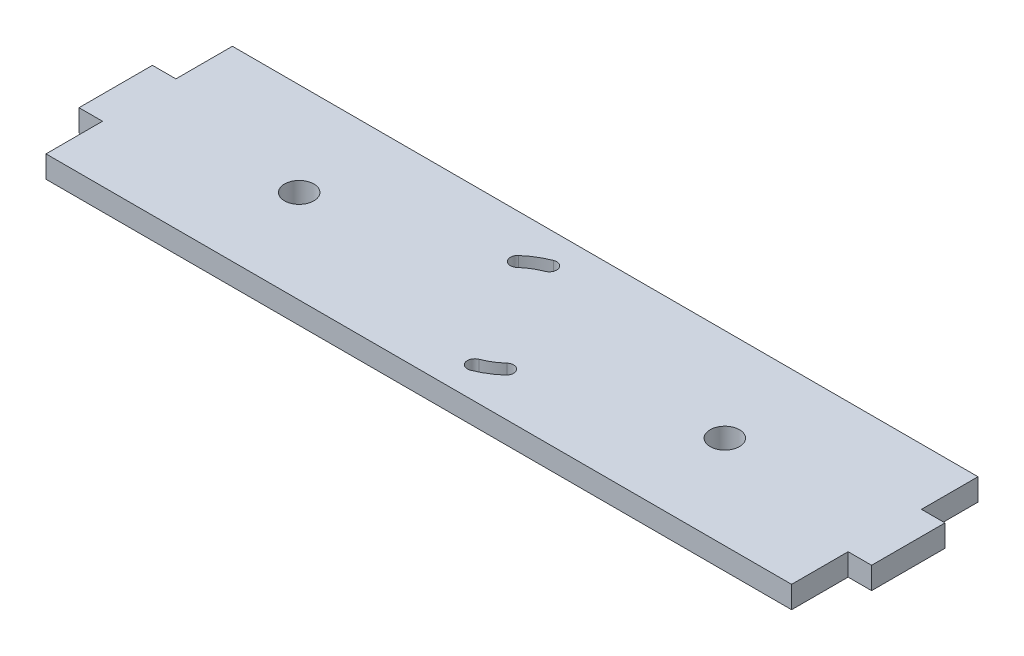
ISO-10303-21;
HEADER;
FILE_DESCRIPTION(('STEP AP214'),'2;1');
FILE_NAME('part.step','',(''),(''),'','','');
FILE_SCHEMA(('AUTOMOTIVE_DESIGN { 1 0 10303 214 1 1 1 1 }'));
ENDSEC;
DATA;
#1=APPLICATION_CONTEXT('core data for automotive mechanical design processes');
#2=APPLICATION_PROTOCOL_DEFINITION('international standard','automotive_design',2000,#1);
#3=PRODUCT_CONTEXT('',#1,'mechanical');
#4=PRODUCT('Part','Part','',(#3));
#5=PRODUCT_RELATED_PRODUCT_CATEGORY('part','',(#4));
#6=PRODUCT_DEFINITION_FORMATION('','',#4);
#7=PRODUCT_DEFINITION_CONTEXT('part definition',#1,'design');
#8=PRODUCT_DEFINITION('design','',#6,#7);
#9=PRODUCT_DEFINITION_SHAPE('','',#8);
#10=(LENGTH_UNIT() NAMED_UNIT(*) SI_UNIT(.MILLI.,.METRE.));
#11=(NAMED_UNIT(*) PLANE_ANGLE_UNIT() SI_UNIT($,.RADIAN.));
#12=(NAMED_UNIT(*) SI_UNIT($,.STERADIAN.) SOLID_ANGLE_UNIT());
#13=UNCERTAINTY_MEASURE_WITH_UNIT(LENGTH_MEASURE(1.E-05),#10,'distance_accuracy_value','');
#14=(GEOMETRIC_REPRESENTATION_CONTEXT(3) GLOBAL_UNCERTAINTY_ASSIGNED_CONTEXT((#13)) GLOBAL_UNIT_ASSIGNED_CONTEXT((#10,
#11,#12)) REPRESENTATION_CONTEXT('',''));
#15=CARTESIAN_POINT('',(0.,0.,0.));
#16=DIRECTION('',(0.,0.,1.));
#17=DIRECTION('',(1.,0.,0.));
#18=AXIS2_PLACEMENT_3D('',#15,#16,#17);
#19=CARTESIAN_POINT('',(-54.,3.,-5.));
#20=DIRECTION('',(0.,0.,1.));
#21=DIRECTION('',(1.,0.,0.));
#22=AXIS2_PLACEMENT_3D('',#19,#20,#21);
#23=PLANE('',#22);
#24=DIRECTION('',(-1.,0.,0.));
#25=VECTOR('',#24,1.);
#26=CARTESIAN_POINT('',(-54.,0.,-5.));
#27=LINE('',#26,#25);
#28=CARTESIAN_POINT('',(-50.8,0.,-5.));
#29=VERTEX_POINT('',#28);
#30=CARTESIAN_POINT('',(-54.,0.,-5.));
#31=VERTEX_POINT('',#30);
#32=EDGE_CURVE('E234',#29,#31,#27,.T.);
#33=ORIENTED_EDGE('',*,*,#32,.T.);
#34=DIRECTION('',(0.,-1.,0.));
#35=VECTOR('',#34,1.);
#36=CARTESIAN_POINT('',(-54.,3.,-5.));
#37=LINE('',#36,#35);
#38=CARTESIAN_POINT('',(-54.,3.,-5.));
#39=VERTEX_POINT('',#38);
#40=EDGE_CURVE('E11',#39,#31,#37,.T.);
#41=ORIENTED_EDGE('',*,*,#40,.F.);
#42=DIRECTION('',(-1.,0.,0.));
#43=VECTOR('',#42,1.);
#44=CARTESIAN_POINT('',(-54.,3.,-5.));
#45=LINE('',#44,#43);
#46=CARTESIAN_POINT('',(-50.8,3.,-5.));
#47=VERTEX_POINT('',#46);
#48=EDGE_CURVE('E241',#47,#39,#45,.T.);
#49=ORIENTED_EDGE('',*,*,#48,.F.);
#50=DIRECTION('',(0.,-1.,0.));
#51=VECTOR('',#50,1.);
#52=CARTESIAN_POINT('',(-50.8,3.,-5.));
#53=LINE('',#52,#51);
#54=EDGE_CURVE('E267',#47,#29,#53,.T.);
#55=ORIENTED_EDGE('',*,*,#54,.T.);
#56=EDGE_LOOP('',(#33,#41,#49,#55));
#57=FACE_BOUND('',#56,.T.);
#58=ADVANCED_FACE('F32',(#57),#23,.F.);
#59=CARTESIAN_POINT('',(-54.,3.,-5.));
#60=DIRECTION('',(1.,0.,0.));
#61=DIRECTION('',(0.,0.,-1.));
#62=AXIS2_PLACEMENT_3D('',#59,#60,#61);
#63=PLANE('',#62);
#64=DIRECTION('',(0.,0.,1.));
#65=VECTOR('',#64,1.);
#66=CARTESIAN_POINT('',(-54.,0.,-5.));
#67=LINE('',#66,#65);
#68=CARTESIAN_POINT('',(-54.,0.,5.));
#69=VERTEX_POINT('',#68);
#70=EDGE_CURVE('E270',#31,#69,#67,.T.);
#71=ORIENTED_EDGE('',*,*,#70,.T.);
#72=DIRECTION('',(0.,-1.,0.));
#73=VECTOR('',#72,1.);
#74=CARTESIAN_POINT('',(-54.,3.,5.));
#75=LINE('',#74,#73);
#76=CARTESIAN_POINT('',(-54.,3.,5.));
#77=VERTEX_POINT('',#76);
#78=EDGE_CURVE('E39',#77,#69,#75,.T.);
#79=ORIENTED_EDGE('',*,*,#78,.F.);
#80=DIRECTION('',(0.,0.,1.));
#81=VECTOR('',#80,1.);
#82=CARTESIAN_POINT('',(-54.,3.,-5.));
#83=LINE('',#82,#81);
#84=EDGE_CURVE('E244',#39,#77,#83,.T.);
#85=ORIENTED_EDGE('',*,*,#84,.F.);
#86=ORIENTED_EDGE('',*,*,#40,.T.);
#87=EDGE_LOOP('',(#71,#79,#85,#86));
#88=FACE_BOUND('',#87,.T.);
#89=ADVANCED_FACE('F346',(#88),#63,.F.);
#90=CARTESIAN_POINT('',(-54.,3.,5.));
#91=DIRECTION('',(0.,0.,-1.));
#92=DIRECTION('',(-1.,0.,0.));
#93=AXIS2_PLACEMENT_3D('',#90,#91,#92);
#94=PLANE('',#93);
#95=DIRECTION('',(1.,0.,0.));
#96=VECTOR('',#95,1.);
#97=CARTESIAN_POINT('',(-54.,0.,5.));
#98=LINE('',#97,#96);
#99=CARTESIAN_POINT('',(-50.8,0.,4.99999999999999));
#100=VERTEX_POINT('',#99);
#101=EDGE_CURVE('E272',#69,#100,#98,.T.);
#102=ORIENTED_EDGE('',*,*,#101,.T.);
#103=DIRECTION('',(0.,-1.,0.));
#104=VECTOR('',#103,1.);
#105=CARTESIAN_POINT('',(-50.8,3.,4.99999999999999));
#106=LINE('',#105,#104);
#107=CARTESIAN_POINT('',(-50.8,3.,4.99999999999999));
#108=VERTEX_POINT('',#107);
#109=EDGE_CURVE('E317',#108,#100,#106,.T.);
#110=ORIENTED_EDGE('',*,*,#109,.F.);
#111=DIRECTION('',(1.,0.,0.));
#112=VECTOR('',#111,1.);
#113=CARTESIAN_POINT('',(-54.,3.,5.));
#114=LINE('',#113,#112);
#115=EDGE_CURVE('E247',#77,#108,#114,.T.);
#116=ORIENTED_EDGE('',*,*,#115,.F.);
#117=ORIENTED_EDGE('',*,*,#78,.T.);
#118=EDGE_LOOP('',(#102,#110,#116,#117));
#119=FACE_BOUND('',#118,.T.);
#120=ADVANCED_FACE('F324',(#119),#94,.F.);
#121=CARTESIAN_POINT('',(-50.8,3.,4.99999999999999));
#122=DIRECTION('',(1.,0.,0.));
#123=DIRECTION('',(0.,0.,-1.));
#124=AXIS2_PLACEMENT_3D('',#121,#122,#123);
#125=PLANE('',#124);
#126=DIRECTION('',(0.,0.,1.));
#127=VECTOR('',#126,1.);
#128=CARTESIAN_POINT('',(-50.8,0.,4.99999999999999));
#129=LINE('',#128,#127);
#130=CARTESIAN_POINT('',(-50.8,0.,12.7));
#131=VERTEX_POINT('',#130);
#132=EDGE_CURVE('E274',#100,#131,#129,.T.);
#133=ORIENTED_EDGE('',*,*,#132,.T.);
#134=DIRECTION('',(0.,-1.,0.));
#135=VECTOR('',#134,1.);
#136=CARTESIAN_POINT('',(-50.8,3.,12.7));
#137=LINE('',#136,#135);
#138=CARTESIAN_POINT('',(-50.8,3.,12.7));
#139=VERTEX_POINT('',#138);
#140=EDGE_CURVE('E314',#139,#131,#137,.T.);
#141=ORIENTED_EDGE('',*,*,#140,.F.);
#142=DIRECTION('',(0.,0.,1.));
#143=VECTOR('',#142,1.);
#144=CARTESIAN_POINT('',(-50.8,3.,4.99999999999999));
#145=LINE('',#144,#143);
#146=EDGE_CURVE('E249',#108,#139,#145,.T.);
#147=ORIENTED_EDGE('',*,*,#146,.F.);
#148=ORIENTED_EDGE('',*,*,#109,.T.);
#149=EDGE_LOOP('',(#133,#141,#147,#148));
#150=FACE_BOUND('',#149,.T.);
#151=ADVANCED_FACE('F334',(#150),#125,.F.);
#152=CARTESIAN_POINT('',(-50.8,3.,12.7));
#153=DIRECTION('',(0.,0.,-1.));
#154=DIRECTION('',(-1.,0.,0.));
#155=AXIS2_PLACEMENT_3D('',#152,#153,#154);
#156=PLANE('',#155);
#157=DIRECTION('',(1.,0.,0.));
#158=VECTOR('',#157,1.);
#159=CARTESIAN_POINT('',(-50.8,0.,12.7));
#160=LINE('',#159,#158);
#161=CARTESIAN_POINT('',(50.8,0.,12.7));
#162=VERTEX_POINT('',#161);
#163=EDGE_CURVE('E276',#131,#162,#160,.T.);
#164=ORIENTED_EDGE('',*,*,#163,.T.);
#165=DIRECTION('',(0.,-1.,0.));
#166=VECTOR('',#165,1.);
#167=CARTESIAN_POINT('',(50.8,3.,12.7));
#168=LINE('',#167,#166);
#169=CARTESIAN_POINT('',(50.8,3.,12.7));
#170=VERTEX_POINT('',#169);
#171=EDGE_CURVE('E311',#170,#162,#168,.T.);
#172=ORIENTED_EDGE('',*,*,#171,.F.);
#173=DIRECTION('',(1.,0.,0.));
#174=VECTOR('',#173,1.);
#175=CARTESIAN_POINT('',(-50.8,3.,12.7));
#176=LINE('',#175,#174);
#177=EDGE_CURVE('E251',#139,#170,#176,.T.);
#178=ORIENTED_EDGE('',*,*,#177,.F.);
#179=ORIENTED_EDGE('',*,*,#140,.T.);
#180=EDGE_LOOP('',(#164,#172,#178,#179));
#181=FACE_BOUND('',#180,.T.);
#182=ADVANCED_FACE('F338',(#181),#156,.F.);
#183=CARTESIAN_POINT('',(50.8,3.,4.99999999999999));
#184=DIRECTION('',(-1.,0.,0.));
#185=DIRECTION('',(0.,0.,1.));
#186=AXIS2_PLACEMENT_3D('',#183,#184,#185);
#187=PLANE('',#186);
#188=DIRECTION('',(0.,0.,-1.));
#189=VECTOR('',#188,1.);
#190=CARTESIAN_POINT('',(50.8,0.,4.99999999999999));
#191=LINE('',#190,#189);
#192=CARTESIAN_POINT('',(50.8,0.,4.99999999999999));
#193=VERTEX_POINT('',#192);
#194=EDGE_CURVE('E278',#162,#193,#191,.T.);
#195=ORIENTED_EDGE('',*,*,#194,.T.);
#196=DIRECTION('',(0.,-1.,0.));
#197=VECTOR('',#196,1.);
#198=CARTESIAN_POINT('',(50.8,3.,4.99999999999999));
#199=LINE('',#198,#197);
#200=CARTESIAN_POINT('',(50.8,3.,4.99999999999999));
#201=VERTEX_POINT('',#200);
#202=EDGE_CURVE('E308',#201,#193,#199,.T.);
#203=ORIENTED_EDGE('',*,*,#202,.F.);
#204=DIRECTION('',(0.,0.,-1.));
#205=VECTOR('',#204,1.);
#206=CARTESIAN_POINT('',(50.8,3.,4.99999999999999));
#207=LINE('',#206,#205);
#208=EDGE_CURVE('E253',#170,#201,#207,.T.);
#209=ORIENTED_EDGE('',*,*,#208,.F.);
#210=ORIENTED_EDGE('',*,*,#171,.T.);
#211=EDGE_LOOP('',(#195,#203,#209,#210));
#212=FACE_BOUND('',#211,.T.);
#213=ADVANCED_FACE('F379',(#212),#187,.F.);
#214=CARTESIAN_POINT('',(50.8,3.,4.99999999999999));
#215=DIRECTION('',(0.,0.,-1.));
#216=DIRECTION('',(-1.,0.,0.));
#217=AXIS2_PLACEMENT_3D('',#214,#215,#216);
#218=PLANE('',#217);
#219=DIRECTION('',(1.,0.,0.));
#220=VECTOR('',#219,1.);
#221=CARTESIAN_POINT('',(50.8,0.,4.99999999999999));
#222=LINE('',#221,#220);
#223=CARTESIAN_POINT('',(54.,0.,5.));
#224=VERTEX_POINT('',#223);
#225=EDGE_CURVE('E280',#193,#224,#222,.T.);
#226=ORIENTED_EDGE('',*,*,#225,.T.);
#227=DIRECTION('',(0.,-1.,0.));
#228=VECTOR('',#227,1.);
#229=CARTESIAN_POINT('',(54.,3.,5.));
#230=LINE('',#229,#228);
#231=CARTESIAN_POINT('',(54.,3.,5.));
#232=VERTEX_POINT('',#231);
#233=EDGE_CURVE('E305',#232,#224,#230,.T.);
#234=ORIENTED_EDGE('',*,*,#233,.F.);
#235=DIRECTION('',(1.,0.,0.));
#236=VECTOR('',#235,1.);
#237=CARTESIAN_POINT('',(50.8,3.,4.99999999999999));
#238=LINE('',#237,#236);
#239=EDGE_CURVE('E255',#201,#232,#238,.T.);
#240=ORIENTED_EDGE('',*,*,#239,.F.);
#241=ORIENTED_EDGE('',*,*,#202,.T.);
#242=EDGE_LOOP('',(#226,#234,#240,#241));
#243=FACE_BOUND('',#242,.T.);
#244=ADVANCED_FACE('F377',(#243),#218,.F.);
#245=CARTESIAN_POINT('',(54.,3.,-5.));
#246=DIRECTION('',(-1.,0.,0.));
#247=DIRECTION('',(0.,0.,1.));
#248=AXIS2_PLACEMENT_3D('',#245,#246,#247);
#249=PLANE('',#248);
#250=DIRECTION('',(0.,0.,-1.));
#251=VECTOR('',#250,1.);
#252=CARTESIAN_POINT('',(54.,0.,-5.));
#253=LINE('',#252,#251);
#254=CARTESIAN_POINT('',(54.,0.,-5.));
#255=VERTEX_POINT('',#254);
#256=EDGE_CURVE('E282',#224,#255,#253,.T.);
#257=ORIENTED_EDGE('',*,*,#256,.T.);
#258=DIRECTION('',(0.,-1.,0.));
#259=VECTOR('',#258,1.);
#260=CARTESIAN_POINT('',(54.,3.,-5.));
#261=LINE('',#260,#259);
#262=CARTESIAN_POINT('',(54.,3.,-5.));
#263=VERTEX_POINT('',#262);
#264=EDGE_CURVE('E302',#263,#255,#261,.T.);
#265=ORIENTED_EDGE('',*,*,#264,.F.);
#266=DIRECTION('',(0.,0.,-1.));
#267=VECTOR('',#266,1.);
#268=CARTESIAN_POINT('',(54.,3.,-5.));
#269=LINE('',#268,#267);
#270=EDGE_CURVE('E257',#232,#263,#269,.T.);
#271=ORIENTED_EDGE('',*,*,#270,.F.);
#272=ORIENTED_EDGE('',*,*,#233,.T.);
#273=EDGE_LOOP('',(#257,#265,#271,#272));
#274=FACE_BOUND('',#273,.T.);
#275=ADVANCED_FACE('F373',(#274),#249,.F.);
#276=CARTESIAN_POINT('',(50.8,3.,-5.));
#277=DIRECTION('',(0.,0.,1.));
#278=DIRECTION('',(1.,0.,0.));
#279=AXIS2_PLACEMENT_3D('',#276,#277,#278);
#280=PLANE('',#279);
#281=DIRECTION('',(-1.,0.,0.));
#282=VECTOR('',#281,1.);
#283=CARTESIAN_POINT('',(50.8,0.,-5.));
#284=LINE('',#283,#282);
#285=CARTESIAN_POINT('',(50.8,0.,-5.));
#286=VERTEX_POINT('',#285);
#287=EDGE_CURVE('E284',#255,#286,#284,.T.);
#288=ORIENTED_EDGE('',*,*,#287,.T.);
#289=DIRECTION('',(0.,-1.,0.));
#290=VECTOR('',#289,1.);
#291=CARTESIAN_POINT('',(50.8,3.,-5.));
#292=LINE('',#291,#290);
#293=CARTESIAN_POINT('',(50.8,3.,-5.));
#294=VERTEX_POINT('',#293);
#295=EDGE_CURVE('E299',#294,#286,#292,.T.);
#296=ORIENTED_EDGE('',*,*,#295,.F.);
#297=DIRECTION('',(-1.,0.,0.));
#298=VECTOR('',#297,1.);
#299=CARTESIAN_POINT('',(50.8,3.,-5.));
#300=LINE('',#299,#298);
#301=EDGE_CURVE('E259',#263,#294,#300,.T.);
#302=ORIENTED_EDGE('',*,*,#301,.F.);
#303=ORIENTED_EDGE('',*,*,#264,.T.);
#304=EDGE_LOOP('',(#288,#296,#302,#303));
#305=FACE_BOUND('',#304,.T.);
#306=ADVANCED_FACE('F368',(#305),#280,.F.);
#307=CARTESIAN_POINT('',(50.8,3.,-12.7));
#308=DIRECTION('',(-1.,0.,0.));
#309=DIRECTION('',(0.,0.,1.));
#310=AXIS2_PLACEMENT_3D('',#307,#308,#309);
#311=PLANE('',#310);
#312=DIRECTION('',(0.,0.,-1.));
#313=VECTOR('',#312,1.);
#314=CARTESIAN_POINT('',(50.8,0.,-12.7));
#315=LINE('',#314,#313);
#316=CARTESIAN_POINT('',(50.8,0.,-12.7));
#317=VERTEX_POINT('',#316);
#318=EDGE_CURVE('E286',#286,#317,#315,.T.);
#319=ORIENTED_EDGE('',*,*,#318,.T.);
#320=DIRECTION('',(0.,-1.,0.));
#321=VECTOR('',#320,1.);
#322=CARTESIAN_POINT('',(50.8,3.,-12.7));
#323=LINE('',#322,#321);
#324=CARTESIAN_POINT('',(50.8,3.,-12.7));
#325=VERTEX_POINT('',#324);
#326=EDGE_CURVE('E296',#325,#317,#323,.T.);
#327=ORIENTED_EDGE('',*,*,#326,.F.);
#328=DIRECTION('',(0.,0.,-1.));
#329=VECTOR('',#328,1.);
#330=CARTESIAN_POINT('',(50.8,3.,-12.7));
#331=LINE('',#330,#329);
#332=EDGE_CURVE('E261',#294,#325,#331,.T.);
#333=ORIENTED_EDGE('',*,*,#332,.F.);
#334=ORIENTED_EDGE('',*,*,#295,.T.);
#335=EDGE_LOOP('',(#319,#327,#333,#334));
#336=FACE_BOUND('',#335,.T.);
#337=ADVANCED_FACE('F362',(#336),#311,.F.);
#338=CARTESIAN_POINT('',(-50.8,3.,-12.7));
#339=DIRECTION('',(0.,0.,1.));
#340=DIRECTION('',(1.,0.,0.));
#341=AXIS2_PLACEMENT_3D('',#338,#339,#340);
#342=PLANE('',#341);
#343=DIRECTION('',(-1.,0.,0.));
#344=VECTOR('',#343,1.);
#345=CARTESIAN_POINT('',(-50.8,0.,-12.7));
#346=LINE('',#345,#344);
#347=CARTESIAN_POINT('',(-50.8,0.,-12.7));
#348=VERTEX_POINT('',#347);
#349=EDGE_CURVE('E288',#317,#348,#346,.T.);
#350=ORIENTED_EDGE('',*,*,#349,.T.);
#351=DIRECTION('',(0.,-1.,0.));
#352=VECTOR('',#351,1.);
#353=CARTESIAN_POINT('',(-50.8,3.,-12.7));
#354=LINE('',#353,#352);
#355=CARTESIAN_POINT('',(-50.8,3.,-12.7));
#356=VERTEX_POINT('',#355);
#357=EDGE_CURVE('E293',#356,#348,#354,.T.);
#358=ORIENTED_EDGE('',*,*,#357,.F.);
#359=DIRECTION('',(-1.,0.,0.));
#360=VECTOR('',#359,1.);
#361=CARTESIAN_POINT('',(-50.8,3.,-12.7));
#362=LINE('',#361,#360);
#363=EDGE_CURVE('E263',#325,#356,#362,.T.);
#364=ORIENTED_EDGE('',*,*,#363,.F.);
#365=ORIENTED_EDGE('',*,*,#326,.T.);
#366=EDGE_LOOP('',(#350,#358,#364,#365));
#367=FACE_BOUND('',#366,.T.);
#368=ADVANCED_FACE('F358',(#367),#342,.F.);
#369=CARTESIAN_POINT('',(-50.8,3.,-12.7));
#370=DIRECTION('',(1.,0.,0.));
#371=DIRECTION('',(0.,0.,-1.));
#372=AXIS2_PLACEMENT_3D('',#369,#370,#371);
#373=PLANE('',#372);
#374=DIRECTION('',(0.,0.,1.));
#375=VECTOR('',#374,1.);
#376=CARTESIAN_POINT('',(-50.8,0.,-12.7));
#377=LINE('',#376,#375);
#378=EDGE_CURVE('E245',#348,#29,#377,.T.);
#379=ORIENTED_EDGE('',*,*,#378,.T.);
#380=ORIENTED_EDGE('',*,*,#54,.F.);
#381=DIRECTION('',(0.,0.,1.));
#382=VECTOR('',#381,1.);
#383=CARTESIAN_POINT('',(-50.8,3.,-12.7));
#384=LINE('',#383,#382);
#385=EDGE_CURVE('E265',#356,#47,#384,.T.);
#386=ORIENTED_EDGE('',*,*,#385,.F.);
#387=ORIENTED_EDGE('',*,*,#357,.T.);
#388=EDGE_LOOP('',(#379,#380,#386,#387));
#389=FACE_BOUND('',#388,.T.);
#390=ADVANCED_FACE('F353',(#389),#373,.F.);
#391=CARTESIAN_POINT('',(0.,3.,0.));
#392=DIRECTION('',(0.,-1.,0.));
#393=DIRECTION('',(0.,0.,-1.));
#394=AXIS2_PLACEMENT_3D('',#391,#392,#393);
#395=PLANE('',#394);
#396=CARTESIAN_POINT('',(-29.,3.,0.));
#397=DIRECTION('',(0.,1.,0.));
#398=DIRECTION('',(0.,0.,1.));
#399=AXIS2_PLACEMENT_3D('',#396,#397,#398);
#400=CIRCLE('',#399,2.);
#401=CARTESIAN_POINT('',(-29.,3.,2.));
#402=VERTEX_POINT('',#401);
#403=EDGE_CURVE('E579',#402,#402,#400,.T.);
#404=ORIENTED_EDGE('',*,*,#403,.F.);
#405=EDGE_LOOP('',(#404));
#406=FACE_BOUND('',#405,.T.);
#407=CARTESIAN_POINT('',(29.,3.,0.));
#408=DIRECTION('',(0.,1.,0.));
#409=DIRECTION('',(0.,0.,1.));
#410=AXIS2_PLACEMENT_3D('',#407,#408,#409);
#411=CIRCLE('',#410,2.);
#412=CARTESIAN_POINT('',(29.,3.,1.99999999999999));
#413=VERTEX_POINT('',#412);
#414=EDGE_CURVE('E192',#413,#413,#411,.T.);
#415=ORIENTED_EDGE('',*,*,#414,.F.);
#416=EDGE_LOOP('',(#415));
#417=FACE_BOUND('',#416,.T.);
#418=CARTESIAN_POINT('',(0.,3.,0.));
#419=DIRECTION('',(0.,1.,0.));
#420=DIRECTION('',(0.,0.,1.));
#421=AXIS2_PLACEMENT_3D('',#418,#419,#420);
#422=CIRCLE('',#421,10.);
#423=CARTESIAN_POINT('',(3.65889014418854,3.,9.30658492212691));
#424=VERTEX_POINT('',#423);
#425=CARTESIAN_POINT('',(6.62178429288262,3.,7.49346200220786));
#426=VERTEX_POINT('',#425);
#427=EDGE_CURVE('E198',#424,#426,#422,.T.);
#428=ORIENTED_EDGE('',*,*,#427,.F.);
#429=CARTESIAN_POINT('',(3.29300112976969,3.,8.37592642991422));
#430=DIRECTION('',(0.,1.,0.));
#431=DIRECTION('',(0.,0.,1.));
#432=AXIS2_PLACEMENT_3D('',#429,#430,#431);
#433=CIRCLE('',#432,1.);
#434=CARTESIAN_POINT('',(2.92711211535083,3.,7.44526793770153));
#435=VERTEX_POINT('',#434);
#436=EDGE_CURVE('E46',#435,#424,#433,.T.);
#437=ORIENTED_EDGE('',*,*,#436,.F.);
#438=CARTESIAN_POINT('',(0.,3.,0.));
#439=DIRECTION('',(0.,-1.,0.));
#440=DIRECTION('',(0.,0.,1.));
#441=AXIS2_PLACEMENT_3D('',#438,#439,#440);
#442=CIRCLE('',#441,8.);
#443=CARTESIAN_POINT('',(5.29742743430609,3.,5.99476960176629));
#444=VERTEX_POINT('',#443);
#445=EDGE_CURVE('E186',#444,#435,#442,.T.);
#446=ORIENTED_EDGE('',*,*,#445,.F.);
#447=CARTESIAN_POINT('',(5.95960586359436,3.,6.74411580198707));
#448=DIRECTION('',(0.,1.,0.));
#449=DIRECTION('',(0.,0.,1.));
#450=AXIS2_PLACEMENT_3D('',#447,#448,#449);
#451=CIRCLE('',#450,1.);
#452=EDGE_CURVE('E189',#426,#444,#451,.T.);
#453=ORIENTED_EDGE('',*,*,#452,.F.);
#454=EDGE_LOOP('',(#428,#437,#446,#453));
#455=FACE_BOUND('',#454,.T.);
#456=CARTESIAN_POINT('',(0.,3.,0.));
#457=DIRECTION('',(0.,1.,0.));
#458=DIRECTION('',(0.,0.,1.));
#459=AXIS2_PLACEMENT_3D('',#456,#457,#458);
#460=CIRCLE('',#459,10.);
#461=CARTESIAN_POINT('',(-3.65889014418854,3.,-9.30658492212691));
#462=VERTEX_POINT('',#461);
#463=CARTESIAN_POINT('',(-6.62178429288261,3.,-7.49346200220786));
#464=VERTEX_POINT('',#463);
#465=EDGE_CURVE('E224',#462,#464,#460,.T.);
#466=ORIENTED_EDGE('',*,*,#465,.F.);
#467=CARTESIAN_POINT('',(-3.29300112976969,3.,-8.37592642991422));
#468=DIRECTION('',(0.,1.,0.));
#469=DIRECTION('',(0.,0.,1.));
#470=AXIS2_PLACEMENT_3D('',#467,#468,#469);
#471=CIRCLE('',#470,1.);
#472=CARTESIAN_POINT('',(-2.92711211535083,3.,-7.44526793770153));
#473=VERTEX_POINT('',#472);
#474=EDGE_CURVE('E205',#473,#462,#471,.T.);
#475=ORIENTED_EDGE('',*,*,#474,.F.);
#476=CARTESIAN_POINT('',(0.,3.,0.));
#477=DIRECTION('',(0.,-1.,0.));
#478=DIRECTION('',(0.,0.,1.));
#479=AXIS2_PLACEMENT_3D('',#476,#477,#478);
#480=CIRCLE('',#479,8.);
#481=CARTESIAN_POINT('',(-5.29742743430609,3.,-5.99476960176629));
#482=VERTEX_POINT('',#481);
#483=EDGE_CURVE('E213',#482,#473,#480,.T.);
#484=ORIENTED_EDGE('',*,*,#483,.F.);
#485=CARTESIAN_POINT('',(-5.95960586359436,3.,-6.74411580198707));
#486=DIRECTION('',(0.,1.,0.));
#487=DIRECTION('',(0.,0.,1.));
#488=AXIS2_PLACEMENT_3D('',#485,#486,#487);
#489=CIRCLE('',#488,1.);
#490=EDGE_CURVE('E227',#464,#482,#489,.T.);
#491=ORIENTED_EDGE('',*,*,#490,.F.);
#492=EDGE_LOOP('',(#466,#475,#484,#491));
#493=FACE_BOUND('',#492,.T.);
#494=ORIENTED_EDGE('',*,*,#48,.T.);
#495=ORIENTED_EDGE('',*,*,#84,.T.);
#496=ORIENTED_EDGE('',*,*,#115,.T.);
#497=ORIENTED_EDGE('',*,*,#146,.T.);
#498=ORIENTED_EDGE('',*,*,#177,.T.);
#499=ORIENTED_EDGE('',*,*,#208,.T.);
#500=ORIENTED_EDGE('',*,*,#239,.T.);
#501=ORIENTED_EDGE('',*,*,#270,.T.);
#502=ORIENTED_EDGE('',*,*,#301,.T.);
#503=ORIENTED_EDGE('',*,*,#332,.T.);
#504=ORIENTED_EDGE('',*,*,#363,.T.);
#505=ORIENTED_EDGE('',*,*,#385,.T.);
#506=EDGE_LOOP('',(#494,#495,#496,#497,#498,#499,#500,#501,#502,#503,#504,#505));
#507=FACE_BOUND('',#506,.T.);
#508=ADVANCED_FACE('F342',(#406,#417,#455,#493,#507),#395,.F.);
#509=CARTESIAN_POINT('',(0.,0.,0.));
#510=DIRECTION('',(0.,-1.,0.));
#511=DIRECTION('',(0.,0.,-1.));
#512=AXIS2_PLACEMENT_3D('',#509,#510,#511);
#513=PLANE('',#512);
#514=CARTESIAN_POINT('',(-29.,0.,0.));
#515=DIRECTION('',(0.,1.,0.));
#516=DIRECTION('',(0.,0.,1.));
#517=AXIS2_PLACEMENT_3D('',#514,#515,#516);
#518=CIRCLE('',#517,2.);
#519=CARTESIAN_POINT('',(-29.,0.,2.));
#520=VERTEX_POINT('',#519);
#521=EDGE_CURVE('E576',#520,#520,#518,.T.);
#522=ORIENTED_EDGE('',*,*,#521,.T.);
#523=EDGE_LOOP('',(#522));
#524=FACE_BOUND('',#523,.T.);
#525=CARTESIAN_POINT('',(29.,0.,0.));
#526=DIRECTION('',(0.,1.,0.));
#527=DIRECTION('',(0.,0.,1.));
#528=AXIS2_PLACEMENT_3D('',#525,#526,#527);
#529=CIRCLE('',#528,2.);
#530=CARTESIAN_POINT('',(29.,0.,1.99999999999999));
#531=VERTEX_POINT('',#530);
#532=EDGE_CURVE('E199',#531,#531,#529,.T.);
#533=ORIENTED_EDGE('',*,*,#532,.T.);
#534=EDGE_LOOP('',(#533));
#535=FACE_BOUND('',#534,.T.);
#536=CARTESIAN_POINT('',(3.29300112976969,0.,8.37592642991422));
#537=DIRECTION('',(0.,1.,0.));
#538=DIRECTION('',(0.,0.,1.));
#539=AXIS2_PLACEMENT_3D('',#536,#537,#538);
#540=CIRCLE('',#539,1.);
#541=CARTESIAN_POINT('',(2.92711211535083,0.,7.44526793770153));
#542=VERTEX_POINT('',#541);
#543=CARTESIAN_POINT('',(3.65889014418854,0.,9.30658492212691));
#544=VERTEX_POINT('',#543);
#545=EDGE_CURVE('E170',#542,#544,#540,.T.);
#546=ORIENTED_EDGE('',*,*,#545,.T.);
#547=CARTESIAN_POINT('',(0.,0.,0.));
#548=DIRECTION('',(0.,1.,0.));
#549=DIRECTION('',(0.,0.,1.));
#550=AXIS2_PLACEMENT_3D('',#547,#548,#549);
#551=CIRCLE('',#550,10.);
#552=CARTESIAN_POINT('',(6.62178429288262,0.,7.49346200220786));
#553=VERTEX_POINT('',#552);
#554=EDGE_CURVE('E179',#544,#553,#551,.T.);
#555=ORIENTED_EDGE('',*,*,#554,.T.);
#556=CARTESIAN_POINT('',(5.95960586359436,0.,6.74411580198707));
#557=DIRECTION('',(0.,1.,0.));
#558=DIRECTION('',(0.,0.,1.));
#559=AXIS2_PLACEMENT_3D('',#556,#557,#558);
#560=CIRCLE('',#559,1.);
#561=CARTESIAN_POINT('',(5.29742743430609,0.,5.99476960176629));
#562=VERTEX_POINT('',#561);
#563=EDGE_CURVE('E54',#553,#562,#560,.T.);
#564=ORIENTED_EDGE('',*,*,#563,.T.);
#565=CARTESIAN_POINT('',(0.,0.,0.));
#566=DIRECTION('',(0.,-1.,0.));
#567=DIRECTION('',(0.,0.,1.));
#568=AXIS2_PLACEMENT_3D('',#565,#566,#567);
#569=CIRCLE('',#568,8.);
#570=EDGE_CURVE('E176',#562,#542,#569,.T.);
#571=ORIENTED_EDGE('',*,*,#570,.T.);
#572=EDGE_LOOP('',(#546,#555,#564,#571));
#573=FACE_BOUND('',#572,.T.);
#574=CARTESIAN_POINT('',(-3.29300112976969,0.,-8.37592642991422));
#575=DIRECTION('',(0.,1.,0.));
#576=DIRECTION('',(0.,0.,1.));
#577=AXIS2_PLACEMENT_3D('',#574,#575,#576);
#578=CIRCLE('',#577,1.);
#579=CARTESIAN_POINT('',(-2.92711211535083,0.,-7.44526793770153));
#580=VERTEX_POINT('',#579);
#581=CARTESIAN_POINT('',(-3.65889014418854,0.,-9.30658492212691));
#582=VERTEX_POINT('',#581);
#583=EDGE_CURVE('E209',#580,#582,#578,.T.);
#584=ORIENTED_EDGE('',*,*,#583,.T.);
#585=CARTESIAN_POINT('',(0.,0.,0.));
#586=DIRECTION('',(0.,1.,0.));
#587=DIRECTION('',(0.,0.,1.));
#588=AXIS2_PLACEMENT_3D('',#585,#586,#587);
#589=CIRCLE('',#588,10.);
#590=CARTESIAN_POINT('',(-6.62178429288261,0.,-7.49346200220786));
#591=VERTEX_POINT('',#590);
#592=EDGE_CURVE('E212',#582,#591,#589,.T.);
#593=ORIENTED_EDGE('',*,*,#592,.T.);
#594=CARTESIAN_POINT('',(-5.95960586359436,0.,-6.74411580198707));
#595=DIRECTION('',(0.,1.,0.));
#596=DIRECTION('',(0.,0.,1.));
#597=AXIS2_PLACEMENT_3D('',#594,#595,#596);
#598=CIRCLE('',#597,1.);
#599=CARTESIAN_POINT('',(-5.29742743430609,0.,-5.99476960176629));
#600=VERTEX_POINT('',#599);
#601=EDGE_CURVE('E216',#591,#600,#598,.T.);
#602=ORIENTED_EDGE('',*,*,#601,.T.);
#603=CARTESIAN_POINT('',(0.,0.,0.));
#604=DIRECTION('',(0.,-1.,0.));
#605=DIRECTION('',(0.,0.,1.));
#606=AXIS2_PLACEMENT_3D('',#603,#604,#605);
#607=CIRCLE('',#606,8.);
#608=EDGE_CURVE('E219',#600,#580,#607,.T.);
#609=ORIENTED_EDGE('',*,*,#608,.T.);
#610=EDGE_LOOP('',(#584,#593,#602,#609));
#611=FACE_BOUND('',#610,.T.);
#612=ORIENTED_EDGE('',*,*,#32,.F.);
#613=ORIENTED_EDGE('',*,*,#378,.F.);
#614=ORIENTED_EDGE('',*,*,#349,.F.);
#615=ORIENTED_EDGE('',*,*,#318,.F.);
#616=ORIENTED_EDGE('',*,*,#287,.F.);
#617=ORIENTED_EDGE('',*,*,#256,.F.);
#618=ORIENTED_EDGE('',*,*,#225,.F.);
#619=ORIENTED_EDGE('',*,*,#194,.F.);
#620=ORIENTED_EDGE('',*,*,#163,.F.);
#621=ORIENTED_EDGE('',*,*,#132,.F.);
#622=ORIENTED_EDGE('',*,*,#101,.F.);
#623=ORIENTED_EDGE('',*,*,#70,.F.);
#624=EDGE_LOOP('',(#612,#613,#614,#615,#616,#617,#618,#619,#620,#621,#622,#623));
#625=FACE_BOUND('',#624,.T.);
#626=ADVANCED_FACE('F183',(#524,#535,#573,#611,#625),#513,.T.);
#627=CARTESIAN_POINT('',(-3.29300112976969,0.,-8.37592642991422));
#628=DIRECTION('',(0.,1.,0.));
#629=DIRECTION('',(0.,0.,1.));
#630=AXIS2_PLACEMENT_3D('',#627,#628,#629);
#631=CYLINDRICAL_SURFACE('',#630,1.);
#632=ORIENTED_EDGE('',*,*,#474,.T.);
#633=DIRECTION('',(0.,1.,0.));
#634=VECTOR('',#633,1.);
#635=CARTESIAN_POINT('',(-3.65889014418854,0.,-9.30658492212691));
#636=LINE('',#635,#634);
#637=EDGE_CURVE('E222',#582,#462,#636,.T.);
#638=ORIENTED_EDGE('',*,*,#637,.F.);
#639=ORIENTED_EDGE('',*,*,#583,.F.);
#640=DIRECTION('',(0.,1.,0.));
#641=VECTOR('',#640,1.);
#642=CARTESIAN_POINT('',(-2.92711211535083,0.,-7.44526793770153));
#643=LINE('',#642,#641);
#644=EDGE_CURVE('E232',#580,#473,#643,.T.);
#645=ORIENTED_EDGE('',*,*,#644,.T.);
#646=EDGE_LOOP('',(#632,#638,#639,#645));
#647=FACE_BOUND('',#646,.T.);
#648=ADVANCED_FACE('F463',(#647),#631,.F.);
#649=CARTESIAN_POINT('',(0.,0.,0.));
#650=DIRECTION('',(0.,1.,0.));
#651=DIRECTION('',(0.,0.,1.));
#652=AXIS2_PLACEMENT_3D('',#649,#650,#651);
#653=CYLINDRICAL_SURFACE('',#652,8.);
#654=ORIENTED_EDGE('',*,*,#483,.T.);
#655=ORIENTED_EDGE('',*,*,#644,.F.);
#656=ORIENTED_EDGE('',*,*,#608,.F.);
#657=DIRECTION('',(0.,1.,0.));
#658=VECTOR('',#657,1.);
#659=CARTESIAN_POINT('',(-5.29742743430609,0.,-5.99476960176629));
#660=LINE('',#659,#658);
#661=EDGE_CURVE('E235',#600,#482,#660,.T.);
#662=ORIENTED_EDGE('',*,*,#661,.T.);
#663=EDGE_LOOP('',(#654,#655,#656,#662));
#664=FACE_BOUND('',#663,.T.);
#665=ADVANCED_FACE('F468',(#664),#653,.T.);
#666=CARTESIAN_POINT('',(-5.95960586359436,0.,-6.74411580198707));
#667=DIRECTION('',(0.,1.,0.));
#668=DIRECTION('',(0.,0.,1.));
#669=AXIS2_PLACEMENT_3D('',#666,#667,#668);
#670=CYLINDRICAL_SURFACE('',#669,1.);
#671=ORIENTED_EDGE('',*,*,#490,.T.);
#672=ORIENTED_EDGE('',*,*,#661,.F.);
#673=ORIENTED_EDGE('',*,*,#601,.F.);
#674=DIRECTION('',(0.,1.,0.));
#675=VECTOR('',#674,1.);
#676=CARTESIAN_POINT('',(-6.62178429288261,0.,-7.49346200220786));
#677=LINE('',#676,#675);
#678=EDGE_CURVE('E237',#591,#464,#677,.T.);
#679=ORIENTED_EDGE('',*,*,#678,.T.);
#680=EDGE_LOOP('',(#671,#672,#673,#679));
#681=FACE_BOUND('',#680,.T.);
#682=ADVANCED_FACE('F480',(#681),#670,.F.);
#683=CARTESIAN_POINT('',(0.,0.,0.));
#684=DIRECTION('',(0.,1.,0.));
#685=DIRECTION('',(0.,0.,1.));
#686=AXIS2_PLACEMENT_3D('',#683,#684,#685);
#687=CYLINDRICAL_SURFACE('',#686,10.);
#688=ORIENTED_EDGE('',*,*,#465,.T.);
#689=ORIENTED_EDGE('',*,*,#678,.F.);
#690=ORIENTED_EDGE('',*,*,#592,.F.);
#691=ORIENTED_EDGE('',*,*,#637,.T.);
#692=EDGE_LOOP('',(#688,#689,#690,#691));
#693=FACE_BOUND('',#692,.T.);
#694=ADVANCED_FACE('F490',(#693),#687,.F.);
#695=CARTESIAN_POINT('',(3.29300112976969,0.,8.37592642991422));
#696=DIRECTION('',(0.,1.,0.));
#697=DIRECTION('',(0.,0.,1.));
#698=AXIS2_PLACEMENT_3D('',#695,#696,#697);
#699=CYLINDRICAL_SURFACE('',#698,1.);
#700=ORIENTED_EDGE('',*,*,#436,.T.);
#701=DIRECTION('',(0.,1.,0.));
#702=VECTOR('',#701,1.);
#703=CARTESIAN_POINT('',(3.65889014418854,0.,9.30658492212691));
#704=LINE('',#703,#702);
#705=EDGE_CURVE('E166',#544,#424,#704,.T.);
#706=ORIENTED_EDGE('',*,*,#705,.F.);
#707=ORIENTED_EDGE('',*,*,#545,.F.);
#708=DIRECTION('',(0.,1.,0.));
#709=VECTOR('',#708,1.);
#710=CARTESIAN_POINT('',(2.92711211535083,0.,7.44526793770153));
#711=LINE('',#710,#709);
#712=EDGE_CURVE('E203',#542,#435,#711,.T.);
#713=ORIENTED_EDGE('',*,*,#712,.T.);
#714=EDGE_LOOP('',(#700,#706,#707,#713));
#715=FACE_BOUND('',#714,.T.);
#716=ADVANCED_FACE('F168',(#715),#699,.F.);
#717=CARTESIAN_POINT('',(0.,0.,0.));
#718=DIRECTION('',(0.,1.,0.));
#719=DIRECTION('',(0.,0.,1.));
#720=AXIS2_PLACEMENT_3D('',#717,#718,#719);
#721=CYLINDRICAL_SURFACE('',#720,8.);
#722=ORIENTED_EDGE('',*,*,#445,.T.);
#723=ORIENTED_EDGE('',*,*,#712,.F.);
#724=ORIENTED_EDGE('',*,*,#570,.F.);
#725=DIRECTION('',(0.,1.,0.));
#726=VECTOR('',#725,1.);
#727=CARTESIAN_POINT('',(5.29742743430609,0.,5.99476960176629));
#728=LINE('',#727,#726);
#729=EDGE_CURVE('E206',#562,#444,#728,.T.);
#730=ORIENTED_EDGE('',*,*,#729,.T.);
#731=EDGE_LOOP('',(#722,#723,#724,#730));
#732=FACE_BOUND('',#731,.T.);
#733=ADVANCED_FACE('F509',(#732),#721,.T.);
#734=CARTESIAN_POINT('',(5.95960586359436,0.,6.74411580198707));
#735=DIRECTION('',(0.,1.,0.));
#736=DIRECTION('',(0.,0.,1.));
#737=AXIS2_PLACEMENT_3D('',#734,#735,#736);
#738=CYLINDRICAL_SURFACE('',#737,1.);
#739=ORIENTED_EDGE('',*,*,#452,.T.);
#740=ORIENTED_EDGE('',*,*,#729,.F.);
#741=ORIENTED_EDGE('',*,*,#563,.F.);
#742=DIRECTION('',(0.,1.,0.));
#743=VECTOR('',#742,1.);
#744=CARTESIAN_POINT('',(6.62178429288262,0.,7.49346200220786));
#745=LINE('',#744,#743);
#746=EDGE_CURVE('E175',#553,#426,#745,.T.);
#747=ORIENTED_EDGE('',*,*,#746,.T.);
#748=EDGE_LOOP('',(#739,#740,#741,#747));
#749=FACE_BOUND('',#748,.T.);
#750=ADVANCED_FACE('F518',(#749),#738,.F.);
#751=CARTESIAN_POINT('',(0.,0.,0.));
#752=DIRECTION('',(0.,1.,0.));
#753=DIRECTION('',(0.,0.,1.));
#754=AXIS2_PLACEMENT_3D('',#751,#752,#753);
#755=CYLINDRICAL_SURFACE('',#754,10.);
#756=ORIENTED_EDGE('',*,*,#427,.T.);
#757=ORIENTED_EDGE('',*,*,#746,.F.);
#758=ORIENTED_EDGE('',*,*,#554,.F.);
#759=ORIENTED_EDGE('',*,*,#705,.T.);
#760=EDGE_LOOP('',(#756,#757,#758,#759));
#761=FACE_BOUND('',#760,.T.);
#762=ADVANCED_FACE('F180',(#761),#755,.F.);
#763=CARTESIAN_POINT('',(29.,0.,0.));
#764=DIRECTION('',(0.,1.,0.));
#765=DIRECTION('',(0.,0.,1.));
#766=AXIS2_PLACEMENT_3D('',#763,#764,#765);
#767=CYLINDRICAL_SURFACE('',#766,2.);
#768=ORIENTED_EDGE('',*,*,#532,.F.);
#769=EDGE_LOOP('',(#768));
#770=FACE_BOUND('',#769,.T.);
#771=ORIENTED_EDGE('',*,*,#414,.T.);
#772=EDGE_LOOP('',(#771));
#773=FACE_BOUND('',#772,.T.);
#774=ADVANCED_FACE('F536',(#770,#773),#767,.F.);
#775=CARTESIAN_POINT('',(-29.,0.,0.));
#776=DIRECTION('',(0.,1.,0.));
#777=DIRECTION('',(0.,0.,1.));
#778=AXIS2_PLACEMENT_3D('',#775,#776,#777);
#779=CYLINDRICAL_SURFACE('',#778,2.);
#780=ORIENTED_EDGE('',*,*,#521,.F.);
#781=EDGE_LOOP('',(#780));
#782=FACE_BOUND('',#781,.T.);
#783=ORIENTED_EDGE('',*,*,#403,.T.);
#784=EDGE_LOOP('',(#783));
#785=FACE_BOUND('',#784,.T.);
#786=ADVANCED_FACE('F559',(#782,#785),#779,.F.);
#787=CLOSED_SHELL('',(#58,#89,#120,#151,#182,#213,#244,#275,#306,#337,#368,#390,#508,#626,#648,
#665,#682,#694,#716,#733,#750,#762,#774,#786));
#788=MANIFOLD_SOLID_BREP('B2',#787);
#789=ADVANCED_BREP_SHAPE_REPRESENTATION('',(#18,#788),#14);
#790=SHAPE_DEFINITION_REPRESENTATION(#9,#789);
ENDSEC;
END-ISO-10303-21;
